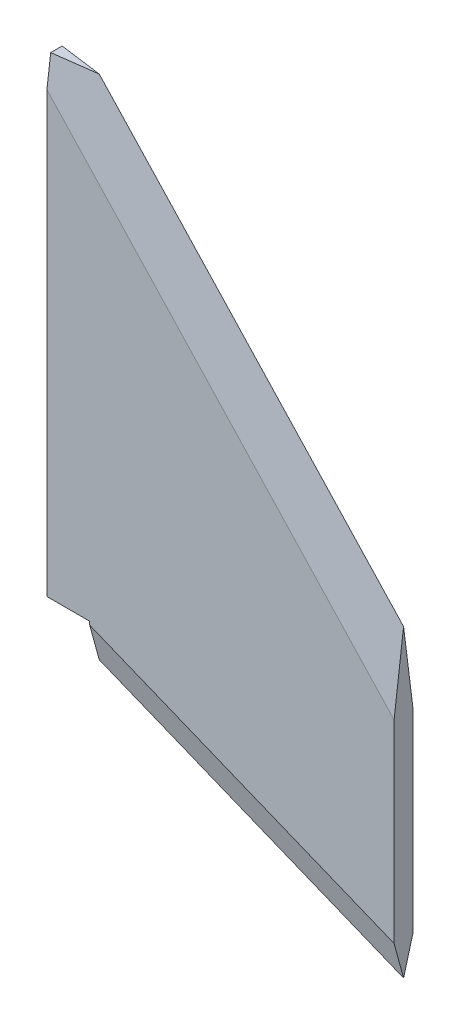
ISO-10303-21;
HEADER;
FILE_DESCRIPTION(('STEP AP214'),'2;1');
FILE_NAME('part.step','',(''),(''),'','','');
FILE_SCHEMA(('AUTOMOTIVE_DESIGN { 1 0 10303 214 1 1 1 1 }'));
ENDSEC;
DATA;
#1=APPLICATION_CONTEXT('core data for automotive mechanical design processes');
#2=APPLICATION_PROTOCOL_DEFINITION('international standard','automotive_design',2000,#1);
#3=PRODUCT_CONTEXT('',#1,'mechanical');
#4=PRODUCT('Part','Part','',(#3));
#5=PRODUCT_RELATED_PRODUCT_CATEGORY('part','',(#4));
#6=PRODUCT_DEFINITION_FORMATION('','',#4);
#7=PRODUCT_DEFINITION_CONTEXT('part definition',#1,'design');
#8=PRODUCT_DEFINITION('design','',#6,#7);
#9=PRODUCT_DEFINITION_SHAPE('','',#8);
#10=(LENGTH_UNIT() NAMED_UNIT(*) SI_UNIT(.MILLI.,.METRE.));
#11=(NAMED_UNIT(*) PLANE_ANGLE_UNIT() SI_UNIT($,.RADIAN.));
#12=(NAMED_UNIT(*) SI_UNIT($,.STERADIAN.) SOLID_ANGLE_UNIT());
#13=UNCERTAINTY_MEASURE_WITH_UNIT(LENGTH_MEASURE(1.E-05),#10,'distance_accuracy_value','');
#14=(GEOMETRIC_REPRESENTATION_CONTEXT(3) GLOBAL_UNCERTAINTY_ASSIGNED_CONTEXT((#13)) GLOBAL_UNIT_ASSIGNED_CONTEXT((#10,
#11,#12)) REPRESENTATION_CONTEXT('',''));
#15=CARTESIAN_POINT('',(0.,0.,0.));
#16=DIRECTION('',(0.,0.,1.));
#17=DIRECTION('',(1.,0.,0.));
#18=AXIS2_PLACEMENT_3D('',#15,#16,#17);
#19=CARTESIAN_POINT('',(76.2,0.,4.7498));
#20=DIRECTION('',(1.,0.,0.));
#21=DIRECTION('',(0.,0.,-1.));
#22=AXIS2_PLACEMENT_3D('',#19,#20,#21);
#23=PLANE('',#22);
#24=DIRECTION('',(0.,0.992319042336789,0.12370496439431));
#25=VECTOR('',#24,1.);
#26=CARTESIAN_POINT('',(76.2,0.984571975786659,-3.14810066152915));
#27=LINE('',#26,#25);
#28=CARTESIAN_POINT('',(76.2,26.2375620148194,0.));
#29=VERTEX_POINT('',#28);
#30=CARTESIAN_POINT('',(76.2,45.2882,2.3749));
#31=VERTEX_POINT('',#30);
#32=EDGE_CURVE('E157',#29,#31,#27,.T.);
#33=ORIENTED_EDGE('',*,*,#32,.T.);
#34=DIRECTION('',(0.,-0.992319042336789,0.123704964394309));
#35=VECTOR('',#34,1.);
#36=CARTESIAN_POINT('',(76.2,0.401511265694692,7.97058646247052));
#37=LINE('',#36,#35);
#38=CARTESIAN_POINT('',(76.2,26.2375620148194,4.7498));
#39=VERTEX_POINT('',#38);
#40=EDGE_CURVE('E142',#31,#39,#37,.T.);
#41=ORIENTED_EDGE('',*,*,#40,.T.);
#42=DIRECTION('',(0.,-1.,0.));
#43=VECTOR('',#42,1.);
#44=CARTESIAN_POINT('',(76.2,0.,4.7498));
#45=LINE('',#44,#43);
#46=CARTESIAN_POINT('',(76.2000000032941,-22.2370304556161,4.74980000258891));
#47=VERTEX_POINT('',#46);
#48=EDGE_CURVE('E189',#39,#47,#45,.T.);
#49=ORIENTED_EDGE('',*,*,#48,.T.);
#50=DIRECTION('',(0.,0.964507832956632,0.264054237165969));
#51=VECTOR('',#50,1.);
#52=CARTESIAN_POINT('',(76.2,-1.55046894742887,10.4131798442372));
#53=LINE('',#52,#51);
#54=CARTESIAN_POINT('',(76.2,-30.9118,2.3749));
#55=VERTEX_POINT('',#54);
#56=EDGE_CURVE('E184',#55,#47,#53,.T.);
#57=ORIENTED_EDGE('',*,*,#56,.F.);
#58=DIRECTION('',(0.,0.964507832956632,-0.264054237165968));
#59=VECTOR('',#58,1.);
#60=CARTESIAN_POINT('',(76.2,-2.76015931629467,-5.33220174837998));
#61=LINE('',#60,#59);
#62=CARTESIAN_POINT('',(76.2,-22.2370304542798,-2.58890114331405E-09));
#63=VERTEX_POINT('',#62);
#64=EDGE_CURVE('E176',#55,#63,#61,.T.);
#65=ORIENTED_EDGE('',*,*,#64,.T.);
#66=DIRECTION('',(0.,-1.,0.));
#67=VECTOR('',#66,1.);
#68=CARTESIAN_POINT('',(76.2,0.,0.));
#69=LINE('',#68,#67);
#70=EDGE_CURVE('E164',#29,#63,#69,.T.);
#71=ORIENTED_EDGE('',*,*,#70,.F.);
#72=EDGE_LOOP('',(#33,#41,#49,#57,#65,#71));
#73=FACE_BOUND('',#72,.T.);
#74=ADVANCED_FACE('F71',(#73),#23,.T.);
#75=CARTESIAN_POINT('',(0.,0.,0.));
#76=DIRECTION('',(0.,0.,1.));
#77=DIRECTION('',(1.,0.,0.));
#78=AXIS2_PLACEMENT_3D('',#75,#76,#77);
#79=PLANE('',#78);
#80=DIRECTION('',(-0.682010394219366,0.731342479401234,0.));
#81=VECTOR('',#80,1.);
#82=CARTESIAN_POINT('',(135.990118396751,-37.8773749459628,0.));
#83=LINE('',#82,#81);
#84=CARTESIAN_POINT('',(-10.7188,119.443488548153,0.));
#85=VERTEX_POINT('',#84);
#86=EDGE_CURVE('E160',#29,#85,#83,.T.);
#87=ORIENTED_EDGE('',*,*,#86,.F.);
#88=ORIENTED_EDGE('',*,*,#70,.T.);
#89=DIRECTION('',(0.926654950689832,-0.375913024996508,0.));
#90=VECTOR('',#89,1.);
#91=CARTESIAN_POINT('',(-1.68562347688937,9.35857080284499,-2.58890114331405E-09));
#92=LINE('',#91,#90);
#93=CARTESIAN_POINT('',(0.,8.6747695457202,-2.58890101259048E-09));
#94=VERTEX_POINT('',#93);
#95=EDGE_CURVE('E153',#94,#63,#92,.T.);
#96=ORIENTED_EDGE('',*,*,#95,.F.);
#97=DIRECTION('',(0.,1.,0.));
#98=VECTOR('',#97,1.);
#99=CARTESIAN_POINT('',(0.,0.,0.));
#100=LINE('',#99,#98);
#101=CARTESIAN_POINT('',(0.,9.52500000000001,0.));
#102=VERTEX_POINT('',#101);
#103=EDGE_CURVE('E193',#94,#102,#100,.T.);
#104=ORIENTED_EDGE('',*,*,#103,.T.);
#105=DIRECTION('',(-1.,0.,0.));
#106=VECTOR('',#105,1.);
#107=CARTESIAN_POINT('',(0.,9.52500000000001,0.));
#108=LINE('',#107,#106);
#109=CARTESIAN_POINT('',(-10.7188,9.52500000000001,0.));
#110=VERTEX_POINT('',#109);
#111=EDGE_CURVE('E188',#102,#110,#108,.T.);
#112=ORIENTED_EDGE('',*,*,#111,.T.);
#113=DIRECTION('',(0.,-1.,0.));
#114=VECTOR('',#113,1.);
#115=CARTESIAN_POINT('',(-10.7188,127.,0.));
#116=LINE('',#115,#114);
#117=EDGE_CURVE('E207',#85,#110,#116,.T.);
#118=ORIENTED_EDGE('',*,*,#117,.F.);
#119=EDGE_LOOP('',(#87,#88,#96,#104,#112,#118));
#120=FACE_BOUND('',#119,.T.);
#121=ADVANCED_FACE('F243',(#120),#79,.F.);
#122=CARTESIAN_POINT('',(0.,0.,4.7498));
#123=DIRECTION('',(0.,0.,1.));
#124=DIRECTION('',(1.,0.,0.));
#125=AXIS2_PLACEMENT_3D('',#122,#123,#124);
#126=PLANE('',#125);
#127=ORIENTED_EDGE('',*,*,#48,.F.);
#128=DIRECTION('',(-0.682010394219366,0.731342479401234,0.));
#129=VECTOR('',#128,1.);
#130=CARTESIAN_POINT('',(135.990118396751,-37.8773749459628,4.7498));
#131=LINE('',#130,#129);
#132=CARTESIAN_POINT('',(-10.7188,119.443488548153,4.7498));
#133=VERTEX_POINT('',#132);
#134=EDGE_CURVE('E148',#39,#133,#131,.T.);
#135=ORIENTED_EDGE('',*,*,#134,.T.);
#136=DIRECTION('',(0.,-1.,0.));
#137=VECTOR('',#136,1.);
#138=CARTESIAN_POINT('',(-10.7188,127.,4.7498));
#139=LINE('',#138,#137);
#140=CARTESIAN_POINT('',(-10.7188,9.52500000000001,4.7498));
#141=VERTEX_POINT('',#140);
#142=EDGE_CURVE('E206',#133,#141,#139,.T.);
#143=ORIENTED_EDGE('',*,*,#142,.T.);
#144=DIRECTION('',(-1.,0.,0.));
#145=VECTOR('',#144,1.);
#146=CARTESIAN_POINT('',(0.,9.52500000000001,4.7498));
#147=LINE('',#146,#145);
#148=CARTESIAN_POINT('',(0.,9.52500000000001,4.7498));
#149=VERTEX_POINT('',#148);
#150=EDGE_CURVE('E202',#149,#141,#147,.T.);
#151=ORIENTED_EDGE('',*,*,#150,.F.);
#152=DIRECTION('',(0.,1.,0.));
#153=VECTOR('',#152,1.);
#154=CARTESIAN_POINT('',(0.,0.,4.7498));
#155=LINE('',#154,#153);
#156=CARTESIAN_POINT('',(0.,8.6747695457202,4.74980000258891));
#157=VERTEX_POINT('',#156);
#158=EDGE_CURVE('E192',#157,#149,#155,.T.);
#159=ORIENTED_EDGE('',*,*,#158,.F.);
#160=DIRECTION('',(0.926654950689832,-0.375913024996508,0.));
#161=VECTOR('',#160,1.);
#162=CARTESIAN_POINT('',(-1.68562347688937,9.35857080284499,4.74980000258891));
#163=LINE('',#162,#161);
#164=EDGE_CURVE('E172',#157,#47,#163,.T.);
#165=ORIENTED_EDGE('',*,*,#164,.T.);
#166=EDGE_LOOP('',(#127,#135,#143,#151,#159,#165));
#167=FACE_BOUND('',#166,.T.);
#168=ADVANCED_FACE('F251',(#167),#126,.T.);
#169=CARTESIAN_POINT('',(-10.7188,127.,4.7498));
#170=DIRECTION('',(1.,0.,0.));
#171=DIRECTION('',(0.,1.,0.));
#172=AXIS2_PLACEMENT_3D('',#169,#170,#171);
#173=PLANE('',#172);
#174=DIRECTION('',(0.,-0.992319042336789,0.123704964394309));
#175=VECTOR('',#174,1.);
#176=CARTESIAN_POINT('',(-10.7188,126.884363323256,3.82220200999367));
#177=LINE('',#176,#175);
#178=CARTESIAN_POINT('',(-10.7188,127.,3.80778645373703));
#179=VERTEX_POINT('',#178);
#180=EDGE_CURVE('E154',#179,#133,#177,.T.);
#181=ORIENTED_EDGE('',*,*,#180,.F.);
#182=DIRECTION('',(0.,0.,-1.));
#183=VECTOR('',#182,1.);
#184=CARTESIAN_POINT('',(-10.7188,127.,4.7498));
#185=LINE('',#184,#183);
#186=CARTESIAN_POINT('',(-10.7188,127.,0.942013546262961));
#187=VERTEX_POINT('',#186);
#188=EDGE_CURVE('E199',#179,#187,#185,.T.);
#189=ORIENTED_EDGE('',*,*,#188,.T.);
#190=DIRECTION('',(0.,0.992319042336789,0.12370496439431));
#191=VECTOR('',#190,1.);
#192=CARTESIAN_POINT('',(-10.7188,127.467424033348,1.00028379094772));
#193=LINE('',#192,#191);
#194=EDGE_CURVE('E87',#85,#187,#193,.T.);
#195=ORIENTED_EDGE('',*,*,#194,.F.);
#196=ORIENTED_EDGE('',*,*,#117,.T.);
#197=DIRECTION('',(0.,0.,-1.));
#198=VECTOR('',#197,1.);
#199=CARTESIAN_POINT('',(-10.7188,9.52500000000001,4.7498));
#200=LINE('',#199,#198);
#201=EDGE_CURVE('E210',#141,#110,#200,.T.);
#202=ORIENTED_EDGE('',*,*,#201,.F.);
#203=ORIENTED_EDGE('',*,*,#142,.F.);
#204=EDGE_LOOP('',(#181,#189,#195,#196,#202,#203));
#205=FACE_BOUND('',#204,.T.);
#206=ADVANCED_FACE('F256',(#205),#173,.F.);
#207=CARTESIAN_POINT('',(0.,127.,4.7498));
#208=DIRECTION('',(0.,-1.,0.));
#209=DIRECTION('',(0.,0.,-1.));
#210=AXIS2_PLACEMENT_3D('',#207,#208,#209);
#211=PLANE('',#210);
#212=DIRECTION('',(-0.991182861929786,0.,0.132501072511427));
#213=VECTOR('',#212,1.);
#214=CARTESIAN_POINT('',(-0.311902248339799,127.,2.4165950131112));
#215=LINE('',#214,#213);
#216=CARTESIAN_POINT('',(0.,127.,2.3749));
#217=VERTEX_POINT('',#216);
#218=EDGE_CURVE('E12',#217,#179,#215,.T.);
#219=ORIENTED_EDGE('',*,*,#218,.F.);
#220=DIRECTION('',(0.991182861929786,0.,0.132501072511428));
#221=VECTOR('',#220,1.);
#222=CARTESIAN_POINT('',(0.311902248339803,127.,2.41659501311118));
#223=LINE('',#222,#221);
#224=EDGE_CURVE('E80',#187,#217,#223,.T.);
#225=ORIENTED_EDGE('',*,*,#224,.F.);
#226=ORIENTED_EDGE('',*,*,#188,.F.);
#227=EDGE_LOOP('',(#219,#225,#226));
#228=FACE_BOUND('',#227,.T.);
#229=ADVANCED_FACE('F267',(#228),#211,.F.);
#230=CARTESIAN_POINT('',(0.,0.,4.7498));
#231=DIRECTION('',(-1.,0.,0.));
#232=DIRECTION('',(0.,0.,1.));
#233=AXIS2_PLACEMENT_3D('',#230,#231,#232);
#234=PLANE('',#233);
#235=DIRECTION('',(0.,-0.964507832956632,-0.264054237165969));
#236=VECTOR('',#235,1.);
#237=CARTESIAN_POINT('',(0.,0.604845184432911,2.54048904792858));
#238=LINE('',#237,#236);
#239=CARTESIAN_POINT('',(0.,0.,2.3749));
#240=VERTEX_POINT('',#239);
#241=EDGE_CURVE('E229',#157,#240,#238,.T.);
#242=ORIENTED_EDGE('',*,*,#241,.F.);
#243=ORIENTED_EDGE('',*,*,#158,.T.);
#244=DIRECTION('',(0.,0.,-1.));
#245=VECTOR('',#244,1.);
#246=CARTESIAN_POINT('',(0.,9.52500000000001,4.7498));
#247=LINE('',#246,#245);
#248=EDGE_CURVE('E196',#149,#102,#247,.T.);
#249=ORIENTED_EDGE('',*,*,#248,.T.);
#250=ORIENTED_EDGE('',*,*,#103,.F.);
#251=DIRECTION('',(0.,-0.964507832956632,0.264054237165968));
#252=VECTOR('',#251,1.);
#253=CARTESIAN_POINT('',(0.,-0.604845184432909,2.54048904792857));
#254=LINE('',#253,#252);
#255=EDGE_CURVE('E219',#94,#240,#254,.T.);
#256=ORIENTED_EDGE('',*,*,#255,.T.);
#257=EDGE_LOOP('',(#242,#243,#249,#250,#256));
#258=FACE_BOUND('',#257,.T.);
#259=ADVANCED_FACE('F239',(#258),#234,.T.);
#260=CARTESIAN_POINT('',(0.,9.52500000000001,4.7498));
#261=DIRECTION('',(0.,-1.,0.));
#262=DIRECTION('',(1.,0.,0.));
#263=AXIS2_PLACEMENT_3D('',#260,#261,#262);
#264=PLANE('',#263);
#265=ORIENTED_EDGE('',*,*,#111,.F.);
#266=ORIENTED_EDGE('',*,*,#248,.F.);
#267=ORIENTED_EDGE('',*,*,#150,.T.);
#268=ORIENTED_EDGE('',*,*,#201,.T.);
#269=EDGE_LOOP('',(#265,#266,#267,#268));
#270=FACE_BOUND('',#269,.T.);
#271=ADVANCED_FACE('F73',(#270),#264,.T.);
#272=CARTESIAN_POINT('',(-4.70740714950435,1.90963816698226,2.3749));
#273=DIRECTION('',(0.106508690531784,0.262552236314997,-0.959021491963136));
#274=DIRECTION('',(0.,0.964507832956632,0.264054237165969));
#275=AXIS2_PLACEMENT_3D('',#272,#273,#274);
#276=PLANE('',#275);
#277=ORIENTED_EDGE('',*,*,#56,.T.);
#278=ORIENTED_EDGE('',*,*,#164,.F.);
#279=ORIENTED_EDGE('',*,*,#241,.T.);
#280=DIRECTION('',(0.926654950689832,-0.375913024996508,0.));
#281=VECTOR('',#280,1.);
#282=CARTESIAN_POINT('',(-4.70740714950435,1.90963816698226,2.3749));
#283=LINE('',#282,#281);
#284=EDGE_CURVE('E95',#240,#55,#283,.T.);
#285=ORIENTED_EDGE('',*,*,#284,.T.);
#286=EDGE_LOOP('',(#277,#278,#279,#285));
#287=FACE_BOUND('',#286,.T.);
#288=ADVANCED_FACE('F234',(#287),#276,.F.);
#289=CARTESIAN_POINT('',(-4.70740714950435,1.90963816698226,2.3749));
#290=DIRECTION('',(-0.106508690531783,-0.262552236314996,-0.959021491963136));
#291=DIRECTION('',(0.,0.964507832956632,-0.264054237165968));
#292=AXIS2_PLACEMENT_3D('',#289,#290,#291);
#293=PLANE('',#292);
#294=ORIENTED_EDGE('',*,*,#284,.F.);
#295=ORIENTED_EDGE('',*,*,#255,.F.);
#296=ORIENTED_EDGE('',*,*,#95,.T.);
#297=ORIENTED_EDGE('',*,*,#64,.F.);
#298=EDGE_LOOP('',(#294,#295,#296,#297));
#299=FACE_BOUND('',#298,.T.);
#300=ADVANCED_FACE('F241',(#299),#293,.T.);
#301=CARTESIAN_POINT('',(145.492256052688,-29.0161959071654,2.3749));
#302=DIRECTION('',(0.131501003507722,0.122630715114444,0.983701780920916));
#303=DIRECTION('',(0.991182861929786,0.,-0.132501072511427));
#304=AXIS2_PLACEMENT_3D('',#301,#302,#303);
#305=PLANE('',#304);
#306=DIRECTION('',(-0.682010394219366,0.731342479401234,0.));
#307=VECTOR('',#306,1.);
#308=CARTESIAN_POINT('',(145.492256052688,-29.0161959071654,2.3749));
#309=LINE('',#308,#307);
#310=EDGE_CURVE('E145',#31,#217,#309,.T.);
#311=ORIENTED_EDGE('',*,*,#310,.T.);
#312=ORIENTED_EDGE('',*,*,#218,.T.);
#313=ORIENTED_EDGE('',*,*,#180,.T.);
#314=ORIENTED_EDGE('',*,*,#134,.F.);
#315=ORIENTED_EDGE('',*,*,#40,.F.);
#316=EDGE_LOOP('',(#311,#312,#313,#314,#315));
#317=FACE_BOUND('',#316,.T.);
#318=ADVANCED_FACE('F144',(#317),#305,.T.);
#319=CARTESIAN_POINT('',(145.492256052688,-29.0161959071654,2.3749));
#320=DIRECTION('',(0.131501003507722,0.122630715114444,-0.983701780920916));
#321=DIRECTION('',(-0.991182861929786,0.,-0.132501072511428));
#322=AXIS2_PLACEMENT_3D('',#319,#320,#321);
#323=PLANE('',#322);
#324=ORIENTED_EDGE('',*,*,#86,.T.);
#325=ORIENTED_EDGE('',*,*,#194,.T.);
#326=ORIENTED_EDGE('',*,*,#224,.T.);
#327=ORIENTED_EDGE('',*,*,#310,.F.);
#328=ORIENTED_EDGE('',*,*,#32,.F.);
#329=EDGE_LOOP('',(#324,#325,#326,#327,#328));
#330=FACE_BOUND('',#329,.T.);
#331=ADVANCED_FACE('F156',(#330),#323,.T.);
#332=CLOSED_SHELL('',(#74,#121,#168,#206,#229,#259,#271,#288,#300,#318,#331));
#333=MANIFOLD_SOLID_BREP('B2',#332);
#334=ADVANCED_BREP_SHAPE_REPRESENTATION('',(#18,#333),#14);
#335=SHAPE_DEFINITION_REPRESENTATION(#9,#334);
ENDSEC;
END-ISO-10303-21;
